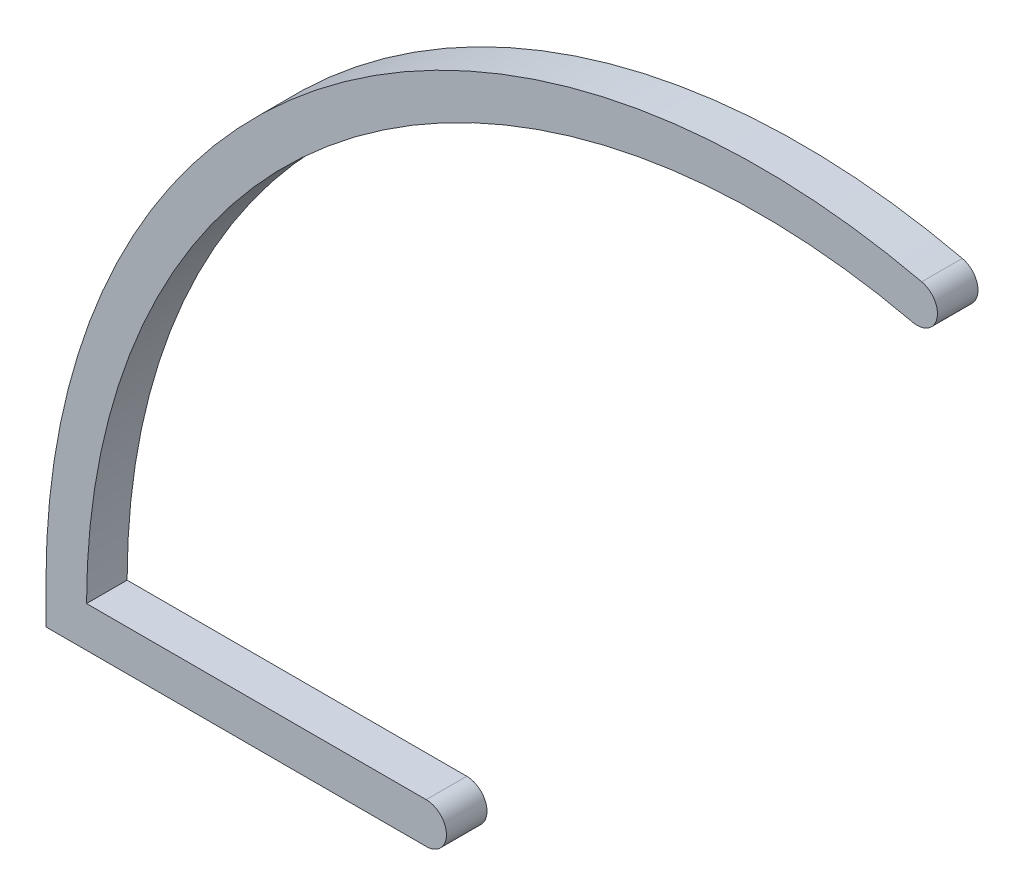
ISO-10303-21;
HEADER;
FILE_DESCRIPTION(('STEP AP214'),'2;1');
FILE_NAME('part.step','',(''),(''),'','','');
FILE_SCHEMA(('AUTOMOTIVE_DESIGN { 1 0 10303 214 1 1 1 1 }'));
ENDSEC;
DATA;
#1=APPLICATION_CONTEXT('core data for automotive mechanical design processes');
#2=APPLICATION_PROTOCOL_DEFINITION('international standard','automotive_design',2000,#1);
#3=PRODUCT_CONTEXT('',#1,'mechanical');
#4=PRODUCT('Part','Part','',(#3));
#5=PRODUCT_RELATED_PRODUCT_CATEGORY('part','',(#4));
#6=PRODUCT_DEFINITION_FORMATION('','',#4);
#7=PRODUCT_DEFINITION_CONTEXT('part definition',#1,'design');
#8=PRODUCT_DEFINITION('design','',#6,#7);
#9=PRODUCT_DEFINITION_SHAPE('','',#8);
#10=(LENGTH_UNIT() NAMED_UNIT(*) SI_UNIT(.MILLI.,.METRE.));
#11=(NAMED_UNIT(*) PLANE_ANGLE_UNIT() SI_UNIT($,.RADIAN.));
#12=(NAMED_UNIT(*) SI_UNIT($,.STERADIAN.) SOLID_ANGLE_UNIT());
#13=UNCERTAINTY_MEASURE_WITH_UNIT(LENGTH_MEASURE(1.E-05),#10,'distance_accuracy_value','');
#14=(GEOMETRIC_REPRESENTATION_CONTEXT(3) GLOBAL_UNCERTAINTY_ASSIGNED_CONTEXT((#13)) GLOBAL_UNIT_ASSIGNED_CONTEXT((#10,
#11,#12)) REPRESENTATION_CONTEXT('',''));
#15=CARTESIAN_POINT('',(0.,0.,0.));
#16=DIRECTION('',(0.,0.,1.));
#17=DIRECTION('',(1.,0.,0.));
#18=AXIS2_PLACEMENT_3D('',#15,#16,#17);
#19=CARTESIAN_POINT('',(552.821544178852,853.961112623667,5.));
#20=DIRECTION('',(0.,0.,-1.));
#21=DIRECTION('',(-1.,0.,0.));
#22=AXIS2_PLACEMENT_3D('',#19,#20,#21);
#23=CYLINDRICAL_SURFACE('',#22,4.99999999999995);
#24=CARTESIAN_POINT('',(552.821544178852,853.961112623667,-5.));
#25=DIRECTION('',(0.,0.,1.));
#26=DIRECTION('',(1.,0.,0.));
#27=AXIS2_PLACEMENT_3D('',#24,#25,#26);
#28=CIRCLE('',#27,4.99999999999995);
#29=CARTESIAN_POINT('',(552.821544178852,848.961112623667,-5.));
#30=VERTEX_POINT('',#29);
#31=CARTESIAN_POINT('',(552.821544178852,858.961112623667,-5.));
#32=VERTEX_POINT('',#31);
#33=EDGE_CURVE('E139',#30,#32,#28,.T.);
#34=ORIENTED_EDGE('',*,*,#33,.T.);
#35=DIRECTION('',(0.,0.,-1.));
#36=VECTOR('',#35,1.);
#37=CARTESIAN_POINT('',(552.821544178852,858.961112623667,5.));
#38=LINE('',#37,#36);
#39=CARTESIAN_POINT('',(552.821544178852,858.961112623667,5.));
#40=VERTEX_POINT('',#39);
#41=EDGE_CURVE('E11',#40,#32,#38,.T.);
#42=ORIENTED_EDGE('',*,*,#41,.F.);
#43=CARTESIAN_POINT('',(552.821544178852,853.961112623667,5.));
#44=DIRECTION('',(0.,0.,1.));
#45=DIRECTION('',(1.,0.,0.));
#46=AXIS2_PLACEMENT_3D('',#43,#44,#45);
#47=CIRCLE('',#46,4.99999999999995);
#48=CARTESIAN_POINT('',(552.821544178852,848.961112623667,5.));
#49=VERTEX_POINT('',#48);
#50=EDGE_CURVE('E159',#49,#40,#47,.T.);
#51=ORIENTED_EDGE('',*,*,#50,.F.);
#52=DIRECTION('',(0.,0.,-1.));
#53=VECTOR('',#52,1.);
#54=CARTESIAN_POINT('',(552.821544178852,848.961112623667,5.));
#55=LINE('',#54,#53);
#56=EDGE_CURVE('E136',#49,#30,#55,.T.);
#57=ORIENTED_EDGE('',*,*,#56,.T.);
#58=EDGE_LOOP('',(#34,#42,#51,#57));
#59=FACE_BOUND('',#58,.T.);
#60=ADVANCED_FACE('F44',(#59),#23,.T.);
#61=CARTESIAN_POINT('',(552.821544178852,858.961112623667,5.));
#62=DIRECTION('',(0.,-1.,0.));
#63=DIRECTION('',(1.,0.,0.));
#64=AXIS2_PLACEMENT_3D('',#61,#62,#63);
#65=PLANE('',#64);
#66=DIRECTION('',(-1.,0.,0.));
#67=VECTOR('',#66,1.);
#68=CARTESIAN_POINT('',(552.821544178852,858.961112623667,-5.));
#69=LINE('',#68,#67);
#70=CARTESIAN_POINT('',(469.088326812255,858.961112623667,-5.));
#71=VERTEX_POINT('',#70);
#72=EDGE_CURVE('E143',#32,#71,#69,.T.);
#73=ORIENTED_EDGE('',*,*,#72,.T.);
#74=DIRECTION('',(0.,0.,-1.));
#75=VECTOR('',#74,1.);
#76=CARTESIAN_POINT('',(469.088326812255,858.961112623667,5.));
#77=LINE('',#76,#75);
#78=CARTESIAN_POINT('',(469.088326812255,858.961112623667,5.));
#79=VERTEX_POINT('',#78);
#80=EDGE_CURVE('E53',#79,#71,#77,.T.);
#81=ORIENTED_EDGE('',*,*,#80,.F.);
#82=DIRECTION('',(-1.,0.,0.));
#83=VECTOR('',#82,1.);
#84=CARTESIAN_POINT('',(552.821544178852,858.961112623667,5.));
#85=LINE('',#84,#83);
#86=EDGE_CURVE('E105',#40,#79,#85,.T.);
#87=ORIENTED_EDGE('',*,*,#86,.F.);
#88=ORIENTED_EDGE('',*,*,#41,.T.);
#89=EDGE_LOOP('',(#73,#81,#87,#88));
#90=FACE_BOUND('',#89,.T.);
#91=ADVANCED_FACE('F194',(#90),#65,.F.);
#92=CARTESIAN_POINT('',(635.289820845301,858.961112623667,5.));
#93=DIRECTION('',(0.,0.,-1.));
#94=DIRECTION('',(-1.,0.,0.));
#95=AXIS2_PLACEMENT_3D('',#92,#93,#94);
#96=CYLINDRICAL_SURFACE('',#95,166.201494033046);
#97=CARTESIAN_POINT('',(635.289820845301,858.961112623667,-5.));
#98=DIRECTION('',(0.,0.,-1.));
#99=DIRECTION('',(1.,0.,0.));
#100=AXIS2_PLACEMENT_3D('',#97,#98,#99);
#101=CIRCLE('',#100,166.201494033046);
#102=CARTESIAN_POINT('',(672.754768877375,1020.88490422876,-5.));
#103=VERTEX_POINT('',#102);
#104=EDGE_CURVE('E150',#71,#103,#101,.T.);
#105=ORIENTED_EDGE('',*,*,#104,.T.);
#106=DIRECTION('',(0.,0.,-1.));
#107=VECTOR('',#106,1.);
#108=CARTESIAN_POINT('',(672.754768877375,1020.88490422876,5.));
#109=LINE('',#108,#107);
#110=CARTESIAN_POINT('',(672.754768877375,1020.88490422876,5.));
#111=VERTEX_POINT('',#110);
#112=EDGE_CURVE('E168',#111,#103,#109,.T.);
#113=ORIENTED_EDGE('',*,*,#112,.F.);
#114=CARTESIAN_POINT('',(635.289820845301,858.961112623667,5.));
#115=DIRECTION('',(0.,0.,-1.));
#116=DIRECTION('',(1.,0.,0.));
#117=AXIS2_PLACEMENT_3D('',#114,#115,#116);
#118=CIRCLE('',#117,166.201494033046);
#119=EDGE_CURVE('E176',#79,#111,#118,.T.);
#120=ORIENTED_EDGE('',*,*,#119,.F.);
#121=ORIENTED_EDGE('',*,*,#80,.T.);
#122=EDGE_LOOP('',(#105,#113,#120,#121));
#123=FACE_BOUND('',#122,.T.);
#124=ADVANCED_FACE('F174',(#123),#96,.F.);
#125=CARTESIAN_POINT('',(673.881863078604,1025.75621397682,5.));
#126=DIRECTION('',(0.,0.,-1.));
#127=DIRECTION('',(-1.,0.,0.));
#128=AXIS2_PLACEMENT_3D('',#125,#126,#127);
#129=CYLINDRICAL_SURFACE('',#128,4.9999999999998);
#130=CARTESIAN_POINT('',(673.881863078604,1025.75621397682,-5.));
#131=DIRECTION('',(0.,0.,1.));
#132=DIRECTION('',(-1.,0.,0.));
#133=AXIS2_PLACEMENT_3D('',#130,#131,#132);
#134=CIRCLE('',#133,4.9999999999998);
#135=CARTESIAN_POINT('',(675.008957279834,1030.62752372489,-5.));
#136=VERTEX_POINT('',#135);
#137=EDGE_CURVE('E148',#103,#136,#134,.T.);
#138=ORIENTED_EDGE('',*,*,#137,.T.);
#139=DIRECTION('',(0.,0.,-1.));
#140=VECTOR('',#139,1.);
#141=CARTESIAN_POINT('',(675.008957279834,1030.62752372489,5.));
#142=LINE('',#141,#140);
#143=CARTESIAN_POINT('',(675.008957279834,1030.62752372489,5.));
#144=VERTEX_POINT('',#143);
#145=EDGE_CURVE('E129',#144,#136,#142,.T.);
#146=ORIENTED_EDGE('',*,*,#145,.F.);
#147=CARTESIAN_POINT('',(673.881863078604,1025.75621397682,5.));
#148=DIRECTION('',(0.,0.,1.));
#149=DIRECTION('',(-1.,0.,0.));
#150=AXIS2_PLACEMENT_3D('',#147,#148,#149);
#151=CIRCLE('',#150,4.9999999999998);
#152=EDGE_CURVE('E119',#111,#144,#151,.T.);
#153=ORIENTED_EDGE('',*,*,#152,.F.);
#154=ORIENTED_EDGE('',*,*,#112,.T.);
#155=EDGE_LOOP('',(#138,#146,#153,#154));
#156=FACE_BOUND('',#155,.T.);
#157=ADVANCED_FACE('F185',(#156),#129,.T.);
#158=CARTESIAN_POINT('',(635.289820845301,858.961112623667,5.));
#159=DIRECTION('',(0.,0.,-1.));
#160=DIRECTION('',(-1.,0.,0.));
#161=AXIS2_PLACEMENT_3D('',#158,#159,#160);
#162=CYLINDRICAL_SURFACE('',#161,176.201494033046);
#163=CARTESIAN_POINT('',(635.289820845301,858.961112623667,-5.));
#164=DIRECTION('',(0.,0.,1.));
#165=DIRECTION('',(-1.,0.,0.));
#166=AXIS2_PLACEMENT_3D('',#163,#164,#165);
#167=CIRCLE('',#166,176.201494033046);
#168=CARTESIAN_POINT('',(459.088326812255,858.961112623667,-5.));
#169=VERTEX_POINT('',#168);
#170=EDGE_CURVE('E130',#136,#169,#167,.T.);
#171=ORIENTED_EDGE('',*,*,#170,.T.);
#172=DIRECTION('',(0.,0.,-1.));
#173=VECTOR('',#172,1.);
#174=CARTESIAN_POINT('',(459.088326812255,858.961112623667,5.));
#175=LINE('',#174,#173);
#176=CARTESIAN_POINT('',(459.088326812255,858.961112623667,5.));
#177=VERTEX_POINT('',#176);
#178=EDGE_CURVE('E125',#177,#169,#175,.T.);
#179=ORIENTED_EDGE('',*,*,#178,.F.);
#180=CARTESIAN_POINT('',(635.289820845301,858.961112623667,5.));
#181=DIRECTION('',(0.,0.,1.));
#182=DIRECTION('',(-1.,0.,0.));
#183=AXIS2_PLACEMENT_3D('',#180,#181,#182);
#184=CIRCLE('',#183,176.201494033046);
#185=EDGE_CURVE('E115',#144,#177,#184,.T.);
#186=ORIENTED_EDGE('',*,*,#185,.F.);
#187=ORIENTED_EDGE('',*,*,#145,.T.);
#188=EDGE_LOOP('',(#171,#179,#186,#187));
#189=FACE_BOUND('',#188,.T.);
#190=ADVANCED_FACE('F124',(#189),#162,.T.);
#191=CARTESIAN_POINT('',(459.088326812255,848.961112623667,5.));
#192=DIRECTION('',(1.,0.,0.));
#193=DIRECTION('',(0.,0.,-1.));
#194=AXIS2_PLACEMENT_3D('',#191,#192,#193);
#195=PLANE('',#194);
#196=DIRECTION('',(0.,-1.,0.));
#197=VECTOR('',#196,1.);
#198=CARTESIAN_POINT('',(459.088326812255,848.961112623667,-5.));
#199=LINE('',#198,#197);
#200=CARTESIAN_POINT('',(459.088326812255,848.961112623667,-5.));
#201=VERTEX_POINT('',#200);
#202=EDGE_CURVE('E88',#169,#201,#199,.T.);
#203=ORIENTED_EDGE('',*,*,#202,.T.);
#204=DIRECTION('',(0.,0.,-1.));
#205=VECTOR('',#204,1.);
#206=CARTESIAN_POINT('',(459.088326812255,848.961112623667,5.));
#207=LINE('',#206,#205);
#208=CARTESIAN_POINT('',(459.088326812255,848.961112623667,5.));
#209=VERTEX_POINT('',#208);
#210=EDGE_CURVE('E127',#209,#201,#207,.T.);
#211=ORIENTED_EDGE('',*,*,#210,.F.);
#212=DIRECTION('',(0.,-1.,0.));
#213=VECTOR('',#212,1.);
#214=CARTESIAN_POINT('',(459.088326812255,848.961112623667,5.));
#215=LINE('',#214,#213);
#216=EDGE_CURVE('E116',#177,#209,#215,.T.);
#217=ORIENTED_EDGE('',*,*,#216,.F.);
#218=ORIENTED_EDGE('',*,*,#178,.T.);
#219=EDGE_LOOP('',(#203,#211,#217,#218));
#220=FACE_BOUND('',#219,.T.);
#221=ADVANCED_FACE('F135',(#220),#195,.F.);
#222=CARTESIAN_POINT('',(552.821544178852,848.961112623667,5.));
#223=DIRECTION('',(0.,1.,0.));
#224=DIRECTION('',(0.,0.,1.));
#225=AXIS2_PLACEMENT_3D('',#222,#223,#224);
#226=PLANE('',#225);
#227=DIRECTION('',(1.,0.,0.));
#228=VECTOR('',#227,1.);
#229=CARTESIAN_POINT('',(552.821544178852,848.961112623667,-5.));
#230=LINE('',#229,#228);
#231=EDGE_CURVE('E92',#201,#30,#230,.T.);
#232=ORIENTED_EDGE('',*,*,#231,.T.);
#233=ORIENTED_EDGE('',*,*,#56,.F.);
#234=DIRECTION('',(1.,0.,0.));
#235=VECTOR('',#234,1.);
#236=CARTESIAN_POINT('',(552.821544178852,848.961112623667,5.));
#237=LINE('',#236,#235);
#238=EDGE_CURVE('E62',#209,#49,#237,.T.);
#239=ORIENTED_EDGE('',*,*,#238,.F.);
#240=ORIENTED_EDGE('',*,*,#210,.T.);
#241=EDGE_LOOP('',(#232,#233,#239,#240));
#242=FACE_BOUND('',#241,.T.);
#243=ADVANCED_FACE('F207',(#242),#226,.F.);
#244=CARTESIAN_POINT('',(552.821544178852,853.961112623667,5.));
#245=DIRECTION('',(0.,0.,1.));
#246=DIRECTION('',(1.,0.,0.));
#247=AXIS2_PLACEMENT_3D('',#244,#245,#246);
#248=PLANE('',#247);
#249=ORIENTED_EDGE('',*,*,#50,.T.);
#250=ORIENTED_EDGE('',*,*,#86,.T.);
#251=ORIENTED_EDGE('',*,*,#119,.T.);
#252=ORIENTED_EDGE('',*,*,#152,.T.);
#253=ORIENTED_EDGE('',*,*,#185,.T.);
#254=ORIENTED_EDGE('',*,*,#216,.T.);
#255=ORIENTED_EDGE('',*,*,#238,.T.);
#256=EDGE_LOOP('',(#249,#250,#251,#252,#253,#254,#255));
#257=FACE_BOUND('',#256,.T.);
#258=ADVANCED_FACE('F114',(#257),#248,.T.);
#259=CARTESIAN_POINT('',(552.821544178852,853.961112623667,-5.));
#260=DIRECTION('',(0.,0.,1.));
#261=DIRECTION('',(1.,0.,0.));
#262=AXIS2_PLACEMENT_3D('',#259,#260,#261);
#263=PLANE('',#262);
#264=ORIENTED_EDGE('',*,*,#33,.F.);
#265=ORIENTED_EDGE('',*,*,#231,.F.);
#266=ORIENTED_EDGE('',*,*,#202,.F.);
#267=ORIENTED_EDGE('',*,*,#170,.F.);
#268=ORIENTED_EDGE('',*,*,#137,.F.);
#269=ORIENTED_EDGE('',*,*,#104,.F.);
#270=ORIENTED_EDGE('',*,*,#72,.F.);
#271=EDGE_LOOP('',(#264,#265,#266,#267,#268,#269,#270));
#272=FACE_BOUND('',#271,.T.);
#273=ADVANCED_FACE('F179',(#272),#263,.F.);
#274=CLOSED_SHELL('',(#60,#91,#124,#157,#190,#221,#243,#258,#273));
#275=MANIFOLD_SOLID_BREP('B2',#274);
#276=ADVANCED_BREP_SHAPE_REPRESENTATION('',(#18,#275),#14);
#277=SHAPE_DEFINITION_REPRESENTATION(#9,#276);
ENDSEC;
END-ISO-10303-21;
